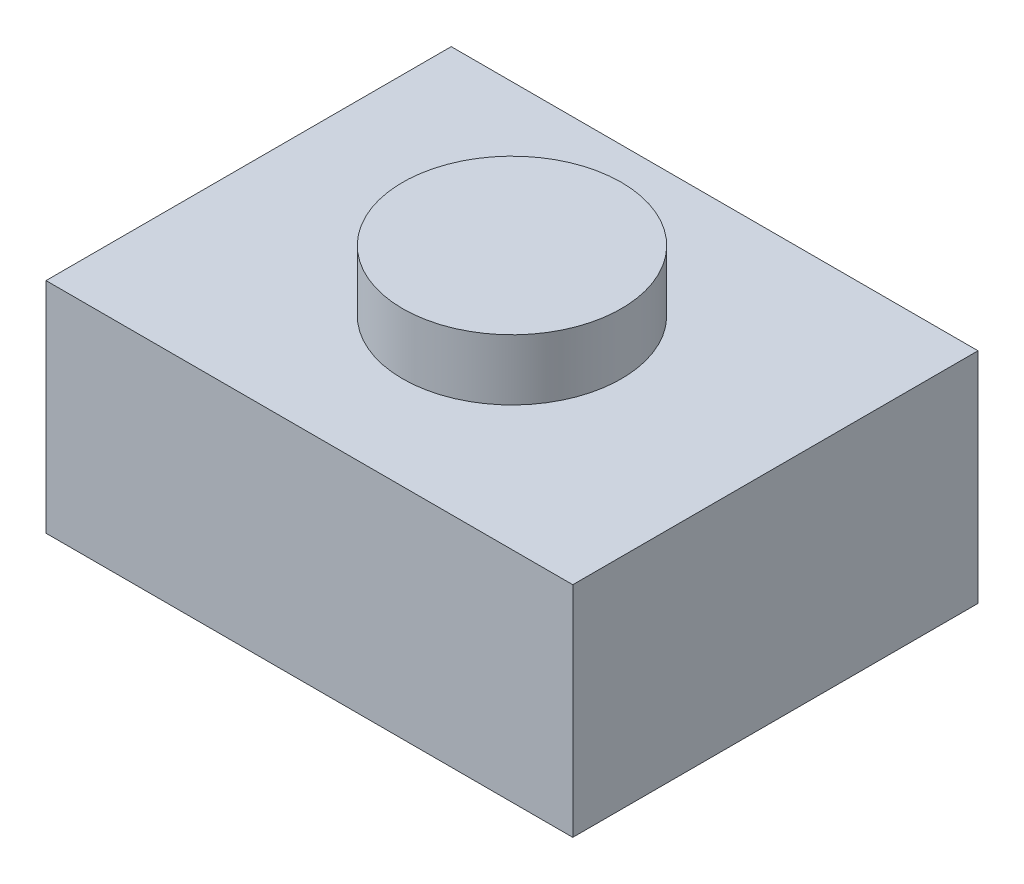
ISO-10303-21;
HEADER;
FILE_DESCRIPTION(('STEP AP214'),'2;1');
FILE_NAME('part.step','',(''),(''),'','','');
FILE_SCHEMA(('AUTOMOTIVE_DESIGN { 1 0 10303 214 1 1 1 1 }'));
ENDSEC;
DATA;
#1=APPLICATION_CONTEXT('core data for automotive mechanical design processes');
#2=APPLICATION_PROTOCOL_DEFINITION('international standard','automotive_design',2000,#1);
#3=PRODUCT_CONTEXT('',#1,'mechanical');
#4=PRODUCT('Part','Part','',(#3));
#5=PRODUCT_RELATED_PRODUCT_CATEGORY('part','',(#4));
#6=PRODUCT_DEFINITION_FORMATION('','',#4);
#7=PRODUCT_DEFINITION_CONTEXT('part definition',#1,'design');
#8=PRODUCT_DEFINITION('design','',#6,#7);
#9=PRODUCT_DEFINITION_SHAPE('','',#8);
#10=(LENGTH_UNIT() NAMED_UNIT(*) SI_UNIT(.MILLI.,.METRE.));
#11=(NAMED_UNIT(*) PLANE_ANGLE_UNIT() SI_UNIT($,.RADIAN.));
#12=(NAMED_UNIT(*) SI_UNIT($,.STERADIAN.) SOLID_ANGLE_UNIT());
#13=UNCERTAINTY_MEASURE_WITH_UNIT(LENGTH_MEASURE(1.E-05),#10,'distance_accuracy_value','');
#14=(GEOMETRIC_REPRESENTATION_CONTEXT(3) GLOBAL_UNCERTAINTY_ASSIGNED_CONTEXT((#13)) GLOBAL_UNIT_ASSIGNED_CONTEXT((#10,
#11,#12)) REPRESENTATION_CONTEXT('',''));
#15=CARTESIAN_POINT('',(0.,0.,0.));
#16=DIRECTION('',(0.,0.,1.));
#17=DIRECTION('',(1.,0.,0.));
#18=AXIS2_PLACEMENT_3D('',#15,#16,#17);
#19=CARTESIAN_POINT('',(0.,1.3716,-2.54));
#20=DIRECTION('',(0.,-1.,0.));
#21=DIRECTION('',(0.,0.,-1.));
#22=AXIS2_PLACEMENT_3D('',#19,#20,#21);
#23=PLANE('',#22);
#24=DIRECTION('',(0.,0.,1.));
#25=VECTOR('',#24,1.);
#26=CARTESIAN_POINT('',(0.,1.3716,0.));
#27=LINE('',#26,#25);
#28=CARTESIAN_POINT('',(0.,1.3716,-2.54));
#29=VERTEX_POINT('',#28);
#30=CARTESIAN_POINT('',(0.,1.3716,0.));
#31=VERTEX_POINT('',#30);
#32=EDGE_CURVE('E85',#29,#31,#27,.T.);
#33=ORIENTED_EDGE('',*,*,#32,.T.);
#34=DIRECTION('',(1.,0.,0.));
#35=VECTOR('',#34,1.);
#36=CARTESIAN_POINT('',(0.,1.3716,0.));
#37=LINE('',#36,#35);
#38=CARTESIAN_POINT('',(3.302,1.3716,0.));
#39=VERTEX_POINT('',#38);
#40=EDGE_CURVE('E80',#31,#39,#37,.T.);
#41=ORIENTED_EDGE('',*,*,#40,.T.);
#42=DIRECTION('',(0.,0.,-1.));
#43=VECTOR('',#42,1.);
#44=CARTESIAN_POINT('',(3.302,1.3716,0.));
#45=LINE('',#44,#43);
#46=CARTESIAN_POINT('',(3.302,1.3716,-2.54));
#47=VERTEX_POINT('',#46);
#48=EDGE_CURVE('E83',#39,#47,#45,.T.);
#49=ORIENTED_EDGE('',*,*,#48,.T.);
#50=DIRECTION('',(-1.,0.,0.));
#51=VECTOR('',#50,1.);
#52=CARTESIAN_POINT('',(0.,1.3716,-2.54));
#53=LINE('',#52,#51);
#54=EDGE_CURVE('E49',#47,#29,#53,.T.);
#55=ORIENTED_EDGE('',*,*,#54,.T.);
#56=EDGE_LOOP('',(#33,#41,#49,#55));
#57=FACE_BOUND('',#56,.T.);
#58=CARTESIAN_POINT('',(1.651,1.3716,-1.27));
#59=DIRECTION('',(0.,-1.,0.));
#60=DIRECTION('',(0.,0.,-1.));
#61=AXIS2_PLACEMENT_3D('',#58,#59,#60);
#62=CIRCLE('',#61,0.6858);
#63=CARTESIAN_POINT('',(1.651,1.3716,-1.9558));
#64=VERTEX_POINT('',#63);
#65=EDGE_CURVE('E11',#64,#64,#62,.F.);
#66=ORIENTED_EDGE('',*,*,#65,.F.);
#67=EDGE_LOOP('',(#66));
#68=FACE_BOUND('',#67,.T.);
#69=ADVANCED_FACE('F32',(#57,#68),#23,.F.);
#70=CARTESIAN_POINT('',(0.,1.3716,0.));
#71=DIRECTION('',(1.,0.,0.));
#72=DIRECTION('',(0.,0.,-1.));
#73=AXIS2_PLACEMENT_3D('',#70,#71,#72);
#74=PLANE('',#73);
#75=DIRECTION('',(0.,0.,1.));
#76=VECTOR('',#75,1.);
#77=CARTESIAN_POINT('',(0.,0.,0.));
#78=LINE('',#77,#76);
#79=CARTESIAN_POINT('',(0.,0.,-2.54));
#80=VERTEX_POINT('',#79);
#81=CARTESIAN_POINT('',(0.,0.,0.));
#82=VERTEX_POINT('',#81);
#83=EDGE_CURVE('E99',#80,#82,#78,.T.);
#84=ORIENTED_EDGE('',*,*,#83,.T.);
#85=DIRECTION('',(0.,-1.,0.));
#86=VECTOR('',#85,1.);
#87=CARTESIAN_POINT('',(0.,1.3716,0.));
#88=LINE('',#87,#86);
#89=EDGE_CURVE('E41',#31,#82,#88,.T.);
#90=ORIENTED_EDGE('',*,*,#89,.F.);
#91=ORIENTED_EDGE('',*,*,#32,.F.);
#92=DIRECTION('',(0.,-1.,0.));
#93=VECTOR('',#92,1.);
#94=CARTESIAN_POINT('',(0.,1.3716,-2.54));
#95=LINE('',#94,#93);
#96=EDGE_CURVE('E95',#29,#80,#95,.T.);
#97=ORIENTED_EDGE('',*,*,#96,.T.);
#98=EDGE_LOOP('',(#84,#90,#91,#97));
#99=FACE_BOUND('',#98,.T.);
#100=ADVANCED_FACE('F34',(#99),#74,.F.);
#101=CARTESIAN_POINT('',(0.,1.3716,0.));
#102=DIRECTION('',(0.,0.,-1.));
#103=DIRECTION('',(-1.,0.,0.));
#104=AXIS2_PLACEMENT_3D('',#101,#102,#103);
#105=PLANE('',#104);
#106=DIRECTION('',(1.,0.,0.));
#107=VECTOR('',#106,1.);
#108=CARTESIAN_POINT('',(0.,0.,0.));
#109=LINE('',#108,#107);
#110=CARTESIAN_POINT('',(3.302,0.,0.));
#111=VERTEX_POINT('',#110);
#112=EDGE_CURVE('E90',#82,#111,#109,.T.);
#113=ORIENTED_EDGE('',*,*,#112,.T.);
#114=DIRECTION('',(0.,-1.,0.));
#115=VECTOR('',#114,1.);
#116=CARTESIAN_POINT('',(3.302,1.3716,0.));
#117=LINE('',#116,#115);
#118=EDGE_CURVE('E88',#39,#111,#117,.T.);
#119=ORIENTED_EDGE('',*,*,#118,.F.);
#120=ORIENTED_EDGE('',*,*,#40,.F.);
#121=ORIENTED_EDGE('',*,*,#89,.T.);
#122=EDGE_LOOP('',(#113,#119,#120,#121));
#123=FACE_BOUND('',#122,.T.);
#124=ADVANCED_FACE('F89',(#123),#105,.F.);
#125=CARTESIAN_POINT('',(3.302,1.3716,0.));
#126=DIRECTION('',(-1.,0.,0.));
#127=DIRECTION('',(0.,0.,1.));
#128=AXIS2_PLACEMENT_3D('',#125,#126,#127);
#129=PLANE('',#128);
#130=DIRECTION('',(0.,0.,-1.));
#131=VECTOR('',#130,1.);
#132=CARTESIAN_POINT('',(3.302,0.,0.));
#133=LINE('',#132,#131);
#134=CARTESIAN_POINT('',(3.302,0.,-2.54));
#135=VERTEX_POINT('',#134);
#136=EDGE_CURVE('E66',#111,#135,#133,.T.);
#137=ORIENTED_EDGE('',*,*,#136,.T.);
#138=DIRECTION('',(0.,-1.,0.));
#139=VECTOR('',#138,1.);
#140=CARTESIAN_POINT('',(3.302,1.3716,-2.54));
#141=LINE('',#140,#139);
#142=EDGE_CURVE('E91',#47,#135,#141,.T.);
#143=ORIENTED_EDGE('',*,*,#142,.F.);
#144=ORIENTED_EDGE('',*,*,#48,.F.);
#145=ORIENTED_EDGE('',*,*,#118,.T.);
#146=EDGE_LOOP('',(#137,#143,#144,#145));
#147=FACE_BOUND('',#146,.T.);
#148=ADVANCED_FACE('F93',(#147),#129,.F.);
#149=CARTESIAN_POINT('',(0.,1.3716,-2.54));
#150=DIRECTION('',(0.,0.,1.));
#151=DIRECTION('',(1.,0.,0.));
#152=AXIS2_PLACEMENT_3D('',#149,#150,#151);
#153=PLANE('',#152);
#154=DIRECTION('',(-1.,0.,0.));
#155=VECTOR('',#154,1.);
#156=CARTESIAN_POINT('',(0.,0.,-2.54));
#157=LINE('',#156,#155);
#158=EDGE_CURVE('E72',#135,#80,#157,.T.);
#159=ORIENTED_EDGE('',*,*,#158,.T.);
#160=ORIENTED_EDGE('',*,*,#96,.F.);
#161=ORIENTED_EDGE('',*,*,#54,.F.);
#162=ORIENTED_EDGE('',*,*,#142,.T.);
#163=EDGE_LOOP('',(#159,#160,#161,#162));
#164=FACE_BOUND('',#163,.T.);
#165=ADVANCED_FACE('F113',(#164),#153,.F.);
#166=CARTESIAN_POINT('',(0.,0.,-2.54));
#167=DIRECTION('',(0.,-1.,0.));
#168=DIRECTION('',(0.,0.,-1.));
#169=AXIS2_PLACEMENT_3D('',#166,#167,#168);
#170=PLANE('',#169);
#171=ORIENTED_EDGE('',*,*,#83,.F.);
#172=ORIENTED_EDGE('',*,*,#158,.F.);
#173=ORIENTED_EDGE('',*,*,#136,.F.);
#174=ORIENTED_EDGE('',*,*,#112,.F.);
#175=EDGE_LOOP('',(#171,#172,#173,#174));
#176=FACE_BOUND('',#175,.T.);
#177=ADVANCED_FACE('F110',(#176),#170,.T.);
#178=CARTESIAN_POINT('',(1.651,1.7526,-1.27));
#179=DIRECTION('',(0.,-1.,0.));
#180=DIRECTION('',(0.,0.,-1.));
#181=AXIS2_PLACEMENT_3D('',#178,#179,#180);
#182=CYLINDRICAL_SURFACE('',#181,0.6858);
#183=CARTESIAN_POINT('',(1.651,1.7526,-1.27));
#184=DIRECTION('',(0.,1.,0.));
#185=DIRECTION('',(0.,0.,1.));
#186=AXIS2_PLACEMENT_3D('',#183,#184,#185);
#187=CIRCLE('',#186,0.6858);
#188=CARTESIAN_POINT('',(1.651,1.7526,-1.9558));
#189=VERTEX_POINT('',#188);
#190=EDGE_CURVE('E102',#189,#189,#187,.T.);
#191=CARTESIAN_POINT('',(1.651,1.7526,-1.9558));
#192=CARTESIAN_POINT('',(1.651,1.74863125,-1.9558));
#193=CARTESIAN_POINT('',(1.651,1.7446625,-1.9558));
#194=CARTESIAN_POINT('',(1.651,1.736725,-1.9558));
#195=CARTESIAN_POINT('',(1.651,1.73275625,-1.9558));
#196=CARTESIAN_POINT('',(1.651,1.72481875,-1.9558));
#197=CARTESIAN_POINT('',(1.651,1.72085,-1.9558));
#198=CARTESIAN_POINT('',(1.651,1.7129125,-1.9558));
#199=CARTESIAN_POINT('',(1.651,1.70894375,-1.9558));
#200=CARTESIAN_POINT('',(1.651,1.70100625,-1.9558));
#201=CARTESIAN_POINT('',(1.651,1.6970375,-1.9558));
#202=CARTESIAN_POINT('',(1.651,1.6891,-1.9558));
#203=CARTESIAN_POINT('',(1.651,1.68513125,-1.9558));
#204=CARTESIAN_POINT('',(1.651,1.67719375,-1.9558));
#205=CARTESIAN_POINT('',(1.651,1.673225,-1.9558));
#206=CARTESIAN_POINT('',(1.651,1.6652875,-1.9558));
#207=CARTESIAN_POINT('',(1.651,1.66131875,-1.9558));
#208=CARTESIAN_POINT('',(1.651,1.65338125,-1.9558));
#209=CARTESIAN_POINT('',(1.651,1.6494125,-1.9558));
#210=CARTESIAN_POINT('',(1.651,1.641475,-1.9558));
#211=CARTESIAN_POINT('',(1.651,1.63750625,-1.9558));
#212=CARTESIAN_POINT('',(1.651,1.62956875,-1.9558));
#213=CARTESIAN_POINT('',(1.651,1.6256,-1.9558));
#214=CARTESIAN_POINT('',(1.651,1.6176625,-1.9558));
#215=CARTESIAN_POINT('',(1.651,1.61369375,-1.9558));
#216=CARTESIAN_POINT('',(1.651,1.60575625,-1.9558));
#217=CARTESIAN_POINT('',(1.651,1.6017875,-1.9558));
#218=CARTESIAN_POINT('',(1.651,1.59385,-1.9558));
#219=CARTESIAN_POINT('',(1.651,1.58988125,-1.9558));
#220=CARTESIAN_POINT('',(1.651,1.58194375,-1.9558));
#221=CARTESIAN_POINT('',(1.651,1.577975,-1.9558));
#222=CARTESIAN_POINT('',(1.651,1.5700375,-1.9558));
#223=CARTESIAN_POINT('',(1.651,1.56606875,-1.9558));
#224=CARTESIAN_POINT('',(1.651,1.55813125,-1.9558));
#225=CARTESIAN_POINT('',(1.651,1.5541625,-1.9558));
#226=CARTESIAN_POINT('',(1.651,1.546225,-1.9558));
#227=CARTESIAN_POINT('',(1.651,1.54225625,-1.9558));
#228=CARTESIAN_POINT('',(1.651,1.53431875,-1.9558));
#229=CARTESIAN_POINT('',(1.651,1.53035,-1.9558));
#230=CARTESIAN_POINT('',(1.651,1.5224125,-1.9558));
#231=CARTESIAN_POINT('',(1.651,1.51844375,-1.9558));
#232=CARTESIAN_POINT('',(1.651,1.51050625,-1.9558));
#233=CARTESIAN_POINT('',(1.651,1.5065375,-1.9558));
#234=CARTESIAN_POINT('',(1.651,1.4986,-1.9558));
#235=CARTESIAN_POINT('',(1.651,1.49463125,-1.9558));
#236=CARTESIAN_POINT('',(1.651,1.48669375,-1.9558));
#237=CARTESIAN_POINT('',(1.651,1.482725,-1.9558));
#238=CARTESIAN_POINT('',(1.651,1.4747875,-1.9558));
#239=CARTESIAN_POINT('',(1.651,1.47081875,-1.9558));
#240=CARTESIAN_POINT('',(1.651,1.46288125,-1.9558));
#241=CARTESIAN_POINT('',(1.651,1.4589125,-1.9558));
#242=CARTESIAN_POINT('',(1.651,1.450975,-1.9558));
#243=CARTESIAN_POINT('',(1.651,1.44700625,-1.9558));
#244=CARTESIAN_POINT('',(1.651,1.43906875,-1.9558));
#245=CARTESIAN_POINT('',(1.651,1.4351,-1.9558));
#246=CARTESIAN_POINT('',(1.651,1.4271625,-1.9558));
#247=CARTESIAN_POINT('',(1.651,1.42319375,-1.9558));
#248=CARTESIAN_POINT('',(1.651,1.41525625,-1.9558));
#249=CARTESIAN_POINT('',(1.651,1.4112875,-1.9558));
#250=CARTESIAN_POINT('',(1.651,1.40335,-1.9558));
#251=CARTESIAN_POINT('',(1.651,1.39938125,-1.9558));
#252=CARTESIAN_POINT('',(1.651,1.39144375,-1.9558));
#253=CARTESIAN_POINT('',(1.651,1.387475,-1.9558));
#254=CARTESIAN_POINT('',(1.651,1.3795375,-1.9558));
#255=CARTESIAN_POINT('',(1.651,1.37556875,-1.9558));
#256=CARTESIAN_POINT('',(1.651,1.3716,-1.9558));
#257=B_SPLINE_CURVE_WITH_KNOTS('',3,(#191,#192,#193,#194,#195,#196,#197,#198,#199,#200,#201,
#202,#203,#204,#205,#206,#207,#208,#209,#210,#211,#212,#213,#214,#215,#216,#217,#218,#219,#220,
#221,#222,#223,#224,#225,#226,#227,#228,#229,#230,#231,#232,#233,#234,#235,#236,#237,#238,#239,
#240,#241,#242,#243,#244,#245,#246,#247,#248,#249,#250,#251,#252,#253,#254,#255,#256),
.UNSPECIFIED.,.F.,.F.,(4,2,2,2,2,2,2,2,2,2,2,2,2,2,2,2,2,2,2,2,2,2,2,2,2,2,2,2,2,2,2,2,4),(0.,
0.0119062500000002,0.0238125000000002,0.0357187500000002,0.0476250000000001,0.0595312500000001,
0.0714375000000001,0.0833437500000001,0.0952500000000001,0.10715625,0.1190625,0.13096875,
0.142875,0.15478125,0.1666875,0.17859375,0.1905,0.20240625,0.2143125,0.22621875,0.238125,
0.25003125,0.2619375,0.27384375,0.28575,0.29765625,0.3095625,0.32146875,0.333375,0.34528125,
0.3571875,0.36909375,0.381),.UNSPECIFIED.);
#258=EDGE_CURVE('BSEAM112',#189,#64,#257,.T.);
#259=ORIENTED_EDGE('',*,*,#190,.F.);
#260=ORIENTED_EDGE('',*,*,#65,.T.);
#261=ORIENTED_EDGE('',*,*,#258,.T.);
#262=ORIENTED_EDGE('',*,*,#258,.F.);
#263=EDGE_LOOP('',(#259,#261,#260,#262));
#264=FACE_BOUND('',#263,.T.);
#265=ADVANCED_FACE('F112',(#264),#182,.T.);
#266=CARTESIAN_POINT('',(1.651,1.7526,-1.27));
#267=DIRECTION('',(0.,1.,0.));
#268=DIRECTION('',(0.,0.,1.));
#269=AXIS2_PLACEMENT_3D('',#266,#267,#268);
#270=PLANE('',#269);
#271=ORIENTED_EDGE('',*,*,#190,.T.);
#272=EDGE_LOOP('',(#271));
#273=FACE_BOUND('',#272,.T.);
#274=ADVANCED_FACE('F119',(#273),#270,.T.);
#275=CLOSED_SHELL('',(#69,#100,#124,#148,#165,#177,#265,#274));
#276=MANIFOLD_SOLID_BREP('B2',#275);
#277=ADVANCED_BREP_SHAPE_REPRESENTATION('',(#18,#276),#14);
#278=SHAPE_DEFINITION_REPRESENTATION(#9,#277);
ENDSEC;
END-ISO-10303-21;
